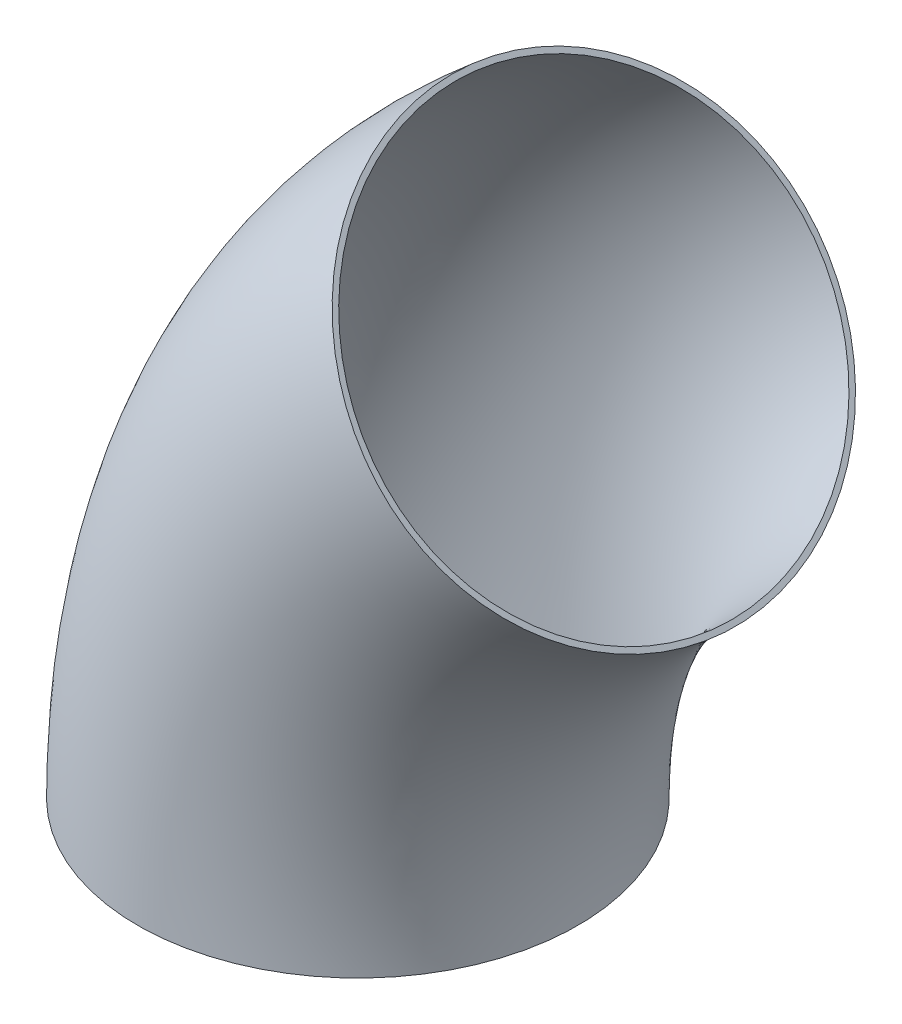
ISO-10303-21;
HEADER;
FILE_DESCRIPTION(('STEP AP214'),'2;1');
FILE_NAME('part.step','',(''),(''),'','','');
FILE_SCHEMA(('AUTOMOTIVE_DESIGN { 1 0 10303 214 1 1 1 1 }'));
ENDSEC;
DATA;
#1=APPLICATION_CONTEXT('core data for automotive mechanical design processes');
#2=APPLICATION_PROTOCOL_DEFINITION('international standard','automotive_design',2000,#1);
#3=PRODUCT_CONTEXT('',#1,'mechanical');
#4=PRODUCT('Part','Part','',(#3));
#5=PRODUCT_RELATED_PRODUCT_CATEGORY('part','',(#4));
#6=PRODUCT_DEFINITION_FORMATION('','',#4);
#7=PRODUCT_DEFINITION_CONTEXT('part definition',#1,'design');
#8=PRODUCT_DEFINITION('design','',#6,#7);
#9=PRODUCT_DEFINITION_SHAPE('','',#8);
#10=(LENGTH_UNIT() NAMED_UNIT(*) SI_UNIT(.MILLI.,.METRE.));
#11=(NAMED_UNIT(*) PLANE_ANGLE_UNIT() SI_UNIT($,.RADIAN.));
#12=(NAMED_UNIT(*) SI_UNIT($,.STERADIAN.) SOLID_ANGLE_UNIT());
#13=UNCERTAINTY_MEASURE_WITH_UNIT(LENGTH_MEASURE(1.E-05),#10,'distance_accuracy_value','');
#14=(GEOMETRIC_REPRESENTATION_CONTEXT(3) GLOBAL_UNCERTAINTY_ASSIGNED_CONTEXT((#13)) GLOBAL_UNIT_ASSIGNED_CONTEXT((#10,
#11,#12)) REPRESENTATION_CONTEXT('',''));
#15=CARTESIAN_POINT('',(0.,0.,0.));
#16=DIRECTION('',(0.,0.,1.));
#17=DIRECTION('',(1.,0.,0.));
#18=AXIS2_PLACEMENT_3D('',#15,#16,#17);
#19=CARTESIAN_POINT('',(-77.1667912538184,91.9638007057058,0.));
#20=DIRECTION('',(0.766044443118979,0.642787609686538,0.));
#21=DIRECTION('',(0.,0.,1.));
#22=AXIS2_PLACEMENT_3D('',#19,#20,#21);
#23=PLANE('',#22);
#24=CARTESIAN_POINT('',(-77.1667912538184,91.9638007057058,0.));
#25=DIRECTION('',(0.766044443118979,0.642787609686538,0.));
#26=DIRECTION('',(-0.642787609686538,0.766044443118979,0.));
#27=AXIS2_PLACEMENT_3D('',#24,#25,#26);
#28=CIRCLE('',#27,39.);
#29=CARTESIAN_POINT('',(-102.235508031593,121.839533987346,0.));
#30=VERTEX_POINT('',#29);
#31=EDGE_CURVE('E47',#30,#30,#28,.T.);
#32=ORIENTED_EDGE('',*,*,#31,.F.);
#33=EDGE_LOOP('',(#32));
#34=FACE_BOUND('',#33,.T.);
#35=CARTESIAN_POINT('',(-77.1667912538184,91.9638007057058,0.));
#36=DIRECTION('',(0.766044443118979,0.642787609686538,0.));
#37=DIRECTION('',(0.,0.,1.));
#38=AXIS2_PLACEMENT_3D('',#35,#36,#37);
#39=CIRCLE('',#38,40.);
#40=CARTESIAN_POINT('',(-102.87829564128,122.605578430465,0.));
#41=VERTEX_POINT('',#40);
#42=EDGE_CURVE('E39',#41,#41,#39,.T.);
#43=ORIENTED_EDGE('',*,*,#42,.T.);
#44=EDGE_LOOP('',(#43));
#45=FACE_BOUND('',#44,.T.);
#46=ADVANCED_FACE('F33',(#34,#45),#23,.T.);
#47=CARTESIAN_POINT('',(-120.050215795929,0.,0.));
#48=DIRECTION('',(0.,1.,0.));
#49=DIRECTION('',(0.,0.,1.));
#50=AXIS2_PLACEMENT_3D('',#47,#48,#49);
#51=PLANE('',#50);
#52=CARTESIAN_POINT('',(-120.050215795929,0.,0.));
#53=DIRECTION('',(0.,1.,0.));
#54=DIRECTION('',(0.,0.,1.));
#55=AXIS2_PLACEMENT_3D('',#52,#53,#54);
#56=CIRCLE('',#55,39.);
#57=CARTESIAN_POINT('',(-159.050215795929,0.,0.));
#58=VERTEX_POINT('',#57);
#59=EDGE_CURVE('E43',#58,#58,#56,.T.);
#60=ORIENTED_EDGE('',*,*,#59,.T.);
#61=EDGE_LOOP('',(#60));
#62=FACE_BOUND('',#61,.T.);
#63=CARTESIAN_POINT('',(-120.050215795929,0.,0.));
#64=DIRECTION('',(0.,1.,0.));
#65=DIRECTION('',(0.,0.,1.));
#66=AXIS2_PLACEMENT_3D('',#63,#64,#65);
#67=CIRCLE('',#66,40.);
#68=CARTESIAN_POINT('',(-160.050215795929,0.,0.));
#69=VERTEX_POINT('',#68);
#70=EDGE_CURVE('E10',#69,#69,#67,.T.);
#71=ORIENTED_EDGE('',*,*,#70,.F.);
#72=EDGE_LOOP('',(#71));
#73=FACE_BOUND('',#72,.T.);
#74=ADVANCED_FACE('F56',(#62,#73),#51,.F.);
#75=CARTESIAN_POINT('',(0.,0.,0.));
#76=DIRECTION('',(0.,0.,1.));
#77=DIRECTION('',(1.,0.,0.));
#78=AXIS2_PLACEMENT_3D('',#75,#76,#77);
#79=TOROIDAL_SURFACE('',#78,120.050215795929,40.);
#80=CARTESIAN_POINT('',(0.,0.,0.));
#81=DIRECTION('',(0.,0.,1.));
#82=DIRECTION('',(1.,0.,0.));
#83=AXIS2_PLACEMENT_3D('',#80,#81,#82);
#84=CIRCLE('',#83,160.050215795929);
#85=EDGE_CURVE('',#41,#69,#84,.T.);
#86=ORIENTED_EDGE('',*,*,#42,.F.);
#87=ORIENTED_EDGE('',*,*,#70,.T.);
#88=ORIENTED_EDGE('',*,*,#85,.T.);
#89=ORIENTED_EDGE('',*,*,#85,.F.);
#90=EDGE_LOOP('',(#86,#88,#87,#89));
#91=FACE_BOUND('',#90,.T.);
#92=ADVANCED_FACE('F60',(#91),#79,.T.);
#93=CARTESIAN_POINT('',(0.,0.,0.));
#94=DIRECTION('',(0.,0.,1.));
#95=DIRECTION('',(1.,0.,0.));
#96=AXIS2_PLACEMENT_3D('',#93,#94,#95);
#97=TOROIDAL_SURFACE('',#96,120.050215795929,39.);
#98=CARTESIAN_POINT('',(0.,0.,0.));
#99=DIRECTION('',(0.,0.,1.));
#100=DIRECTION('',(1.,0.,0.));
#101=AXIS2_PLACEMENT_3D('',#98,#99,#100);
#102=CIRCLE('',#101,159.050215795929);
#103=EDGE_CURVE('',#30,#58,#102,.T.);
#104=ORIENTED_EDGE('',*,*,#31,.T.);
#105=ORIENTED_EDGE('',*,*,#59,.F.);
#106=ORIENTED_EDGE('',*,*,#103,.T.);
#107=ORIENTED_EDGE('',*,*,#103,.F.);
#108=EDGE_LOOP('',(#104,#106,#105,#107));
#109=FACE_BOUND('',#108,.T.);
#110=ADVANCED_FACE('F53',(#109),#97,.F.);
#111=CLOSED_SHELL('',(#46,#74,#92,#110));
#112=MANIFOLD_SOLID_BREP('B2',#111);
#113=ADVANCED_BREP_SHAPE_REPRESENTATION('',(#18,#112),#14);
#114=SHAPE_DEFINITION_REPRESENTATION(#9,#113);
ENDSEC;
END-ISO-10303-21;
